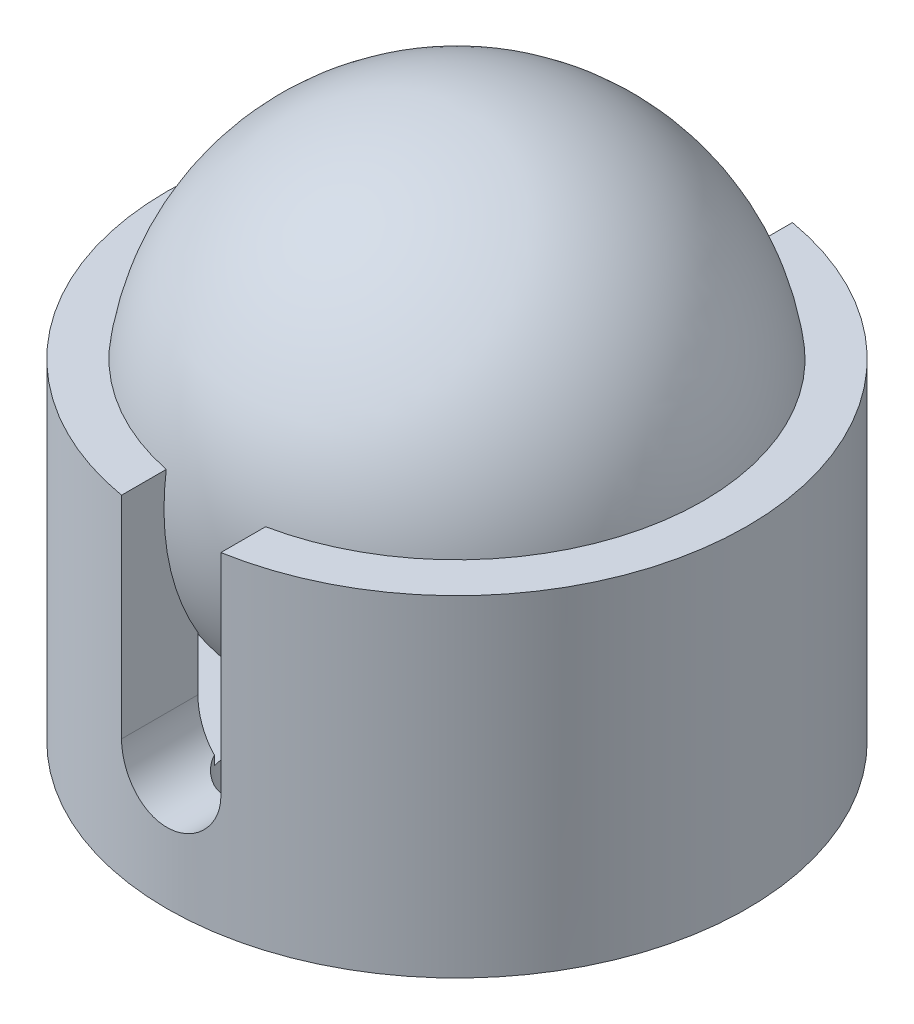
ISO-10303-21;
HEADER;
FILE_DESCRIPTION(('STEP AP214'),'2;1');
FILE_NAME('part.step','',(''),(''),'','','');
FILE_SCHEMA(('AUTOMOTIVE_DESIGN { 1 0 10303 214 1 1 1 1 }'));
ENDSEC;
DATA;
#1=APPLICATION_CONTEXT('core data for automotive mechanical design processes');
#2=APPLICATION_PROTOCOL_DEFINITION('international standard','automotive_design',2000,#1);
#3=PRODUCT_CONTEXT('',#1,'mechanical');
#4=PRODUCT('Part','Part','',(#3));
#5=PRODUCT_RELATED_PRODUCT_CATEGORY('part','',(#4));
#6=PRODUCT_DEFINITION_FORMATION('','',#4);
#7=PRODUCT_DEFINITION_CONTEXT('part definition',#1,'design');
#8=PRODUCT_DEFINITION('design','',#6,#7);
#9=PRODUCT_DEFINITION_SHAPE('','',#8);
#10=(LENGTH_UNIT() NAMED_UNIT(*) SI_UNIT(.MILLI.,.METRE.));
#11=(NAMED_UNIT(*) PLANE_ANGLE_UNIT() SI_UNIT($,.RADIAN.));
#12=(NAMED_UNIT(*) SI_UNIT($,.STERADIAN.) SOLID_ANGLE_UNIT());
#13=UNCERTAINTY_MEASURE_WITH_UNIT(LENGTH_MEASURE(1.E-05),#10,'distance_accuracy_value','');
#14=(GEOMETRIC_REPRESENTATION_CONTEXT(3) GLOBAL_UNCERTAINTY_ASSIGNED_CONTEXT((#13)) GLOBAL_UNIT_ASSIGNED_CONTEXT((#10,
#11,#12)) REPRESENTATION_CONTEXT('',''));
#15=CARTESIAN_POINT('',(0.,0.,0.));
#16=DIRECTION('',(0.,0.,1.));
#17=DIRECTION('',(1.,0.,0.));
#18=AXIS2_PLACEMENT_3D('',#15,#16,#17);
#19=CARTESIAN_POINT('',(0.,2.7,0.));
#20=DIRECTION('',(0.,1.,0.));
#21=DIRECTION('',(0.,0.,1.));
#22=AXIS2_PLACEMENT_3D('',#19,#20,#21);
#23=CYLINDRICAL_SURFACE('',#22,8.255);
#24=CARTESIAN_POINT('',(0.,2.7,0.));
#25=DIRECTION('',(0.,1.,0.));
#26=DIRECTION('',(0.,0.,1.));
#27=AXIS2_PLACEMENT_3D('',#24,#25,#26);
#28=CIRCLE('',#27,8.255);
#29=CARTESIAN_POINT('',(-1.12700211108679,2.7,-8.17770696721312));
#30=VERTEX_POINT('',#29);
#31=CARTESIAN_POINT('',(-1.12700211108679,2.7,8.17770696721311));
#32=VERTEX_POINT('',#31);
#33=EDGE_CURVE('E150',#30,#32,#28,.T.);
#34=ORIENTED_EDGE('',*,*,#33,.F.);
#35=DIRECTION('',(0.,1.,0.));
#36=VECTOR('',#35,1.);
#37=CARTESIAN_POINT('',(-1.12700211108679,4.68904755939854,-8.17770696721312));
#38=LINE('',#37,#36);
#39=CARTESIAN_POINT('',(-1.12700211108679,3.06913176294126,-8.17770696721312));
#40=VERTEX_POINT('',#39);
#41=EDGE_CURVE('E134',#40,#30,#38,.F.);
#42=ORIENTED_EDGE('',*,*,#41,.F.);
#43=CARTESIAN_POINT('',(1.905,4.605,-8.03218525682768));
#44=CARTESIAN_POINT('',(1.9050004949392,4.55216821729791,-8.03218203879732));
#45=CARTESIAN_POINT('',(1.90280080921067,4.49936247493051,-8.03270717235725));
#46=CARTESIAN_POINT('',(1.89403094658263,4.39414326350665,-8.03478076524727));
#47=CARTESIAN_POINT('',(1.88746142429757,4.34172973688419,-8.03632907130286));
#48=CARTESIAN_POINT('',(1.86128864629187,4.18584224632262,-8.04244801156491));
#49=CARTESIAN_POINT('',(1.83522080408885,4.08343529123638,-8.04849302089267));
#50=CARTESIAN_POINT('',(1.76667175449757,3.88460255311886,-8.06381500734212));
#51=CARTESIAN_POINT('',(1.72419070255448,3.78817671345208,-8.07309195385492));
#52=CARTESIAN_POINT('',(1.62406527798472,3.60377986365608,-8.09382741519176));
#53=CARTESIAN_POINT('',(1.56641785887882,3.5158105570497,-8.10528636818917));
#54=CARTESIAN_POINT('',(1.43645531360547,3.3492255076306,-8.12933261434897));
#55=CARTESIAN_POINT('',(1.36391060377247,3.27079118867273,-8.14193559653943));
#56=CARTESIAN_POINT('',(1.20670065058701,3.12708189753966,-8.16671418743262));
#57=CARTESIAN_POINT('',(1.12203350133048,3.06180899851187,-8.17888972855704));
#58=CARTESIAN_POINT('',(0.941751579429275,2.94555261185414,-8.20161368130246));
#59=CARTESIAN_POINT('',(0.846019761038323,2.8947462141507,-8.21214127169099));
#60=CARTESIAN_POINT('',(0.647097553577047,2.81001475173687,-8.23020347271179));
#61=CARTESIAN_POINT('',(0.543908485299424,2.77608670596432,-8.2377386118247));
#62=CARTESIAN_POINT('',(0.334897812779147,2.72664974398737,-8.24885603313697));
#63=CARTESIAN_POINT('',(0.229153018304933,2.71083126635109,-8.25250467254132));
#64=CARTESIAN_POINT('',(0.016449470314749,2.697093061312,-8.25566843713098));
#65=CARTESIAN_POINT('',(-0.0905091555585277,2.69917146903084,-8.25518399298893));
#66=CARTESIAN_POINT('',(-0.300460364163674,2.72094109315607,-8.25018624071996));
#67=CARTESIAN_POINT('',(-0.40348969555063,2.74029805669144,-8.2457493949175));
#68=CARTESIAN_POINT('',(-0.604795878082817,2.79554078705041,-8.23343323662216));
#69=CARTESIAN_POINT('',(-0.703072538393995,2.83142721697394,-8.22555378602559));
#70=CARTESIAN_POINT('',(-0.892996247776186,2.9189969205741,-8.20711687811029));
#71=CARTESIAN_POINT('',(-0.984583992533556,2.97080423091211,-8.19653850795575));
#72=CARTESIAN_POINT('',(-1.15788342478523,3.08865083741645,-8.17385957434472));
#73=CARTESIAN_POINT('',(-1.23959389020896,3.15469189185143,-8.16175882290817));
#74=CARTESIAN_POINT('',(-1.3928034399678,3.30093157665607,-8.13703217107836));
#75=CARTESIAN_POINT('',(-1.4640241759925,3.3814211038199,-8.12440059415062));
#76=CARTESIAN_POINT('',(-1.59203014189117,3.55335758711994,-8.10029145269488));
#77=CARTESIAN_POINT('',(-1.64881142789759,3.64480752687592,-8.08881420396651));
#78=CARTESIAN_POINT('',(-1.7464734319975,3.83656846314659,-8.06829385553909));
#79=CARTESIAN_POINT('',(-1.78728722256415,3.9369146393702,-8.05926104939383));
#80=CARTESIAN_POINT('',(-1.85133161484183,4.14323888784974,-8.04479287806192));
#81=CARTESIAN_POINT('',(-1.8745884213678,4.24920831303048,-8.03935215301505));
#82=CARTESIAN_POINT('',(-1.89413110521301,4.39755626711869,-8.03475650344726));
#83=CARTESIAN_POINT('',(-1.8982079605321,4.43896954145468,-8.03379358952638));
#84=CARTESIAN_POINT('',(-1.9036391869607,4.5219154526723,-8.03250835935586));
#85=CARTESIAN_POINT('',(-1.90499804312288,4.56344777947494,-8.03218498778796));
#86=CARTESIAN_POINT('',(-1.905,4.605,-8.03218525682768));
#87=B_SPLINE_CURVE_WITH_KNOTS('',3,(#43,#44,#45,#46,#47,#48,#49,#50,#51,#52,#53,#54,#55,#56,#57,
#58,#59,#60,#61,#62,#63,#64,#65,#66,#67,#68,#69,#70,#71,#72,#73,#74,#75,#76,#77,#78,#79,#80,#81,
#82,#83,#84,#85,#86),.UNSPECIFIED.,.F.,.F.,(4,2,2,2,2,2,2,2,2,2,2,2,2,2,2,2,2,2,2,2,2,4),(0.,
0.15839566344919,0.316767604100791,0.632664406073719,0.948558216344822,1.26451552894804,
1.5857669443639,1.90706892287692,2.23214980580353,2.55717325239468,2.87655372217706,
3.19590091250888,3.50920109847809,3.82251385396565,4.13833226029031,4.45418970147392,
4.77731778029453,5.10053402098423,5.42509086388387,5.74916232390456,5.8739620293273,
5.99855562852327),.UNSPECIFIED.);
#88=CARTESIAN_POINT('',(-1.905,4.605,-8.03218525682768));
#89=VERTEX_POINT('',#88);
#90=EDGE_CURVE('E180',#40,#89,#87,.T.);
#91=ORIENTED_EDGE('',*,*,#90,.T.);
#92=DIRECTION('',(0.,1.,0.));
#93=VECTOR('',#92,1.);
#94=CARTESIAN_POINT('',(-1.905,2.7,-8.03218525682768));
#95=LINE('',#94,#93);
#96=CARTESIAN_POINT('',(-1.90499999999999,6.67809511879709,-8.03218525682768));
#97=VERTEX_POINT('',#96);
#98=EDGE_CURVE('E42',#89,#97,#95,.T.);
#99=ORIENTED_EDGE('',*,*,#98,.T.);
#100=CARTESIAN_POINT('',(0.,6.67809511879709,0.));
#101=DIRECTION('',(0.,1.,0.));
#102=DIRECTION('',(0.,0.,1.));
#103=AXIS2_PLACEMENT_3D('',#100,#101,#102);
#104=CIRCLE('',#103,8.255);
#105=CARTESIAN_POINT('',(-1.90499999999999,6.67809511879709,8.03218525682768));
#106=VERTEX_POINT('',#105);
#107=EDGE_CURVE('E178',#106,#97,#104,.F.);
#108=ORIENTED_EDGE('',*,*,#107,.F.);
#109=DIRECTION('',(0.,1.,0.));
#110=VECTOR('',#109,1.);
#111=CARTESIAN_POINT('',(-1.905,2.7,8.03218525682768));
#112=LINE('',#111,#110);
#113=CARTESIAN_POINT('',(-1.905,4.605,8.03218525682768));
#114=VERTEX_POINT('',#113);
#115=EDGE_CURVE('E172',#106,#114,#112,.F.);
#116=ORIENTED_EDGE('',*,*,#115,.T.);
#117=CARTESIAN_POINT('',(-1.905,4.605,8.03218525682768));
#118=CARTESIAN_POINT('',(-1.90500049469628,4.55216655621658,8.03218203799778));
#119=CARTESIAN_POINT('',(-1.90280067052275,4.4993591523997,8.03270720505691));
#120=CARTESIAN_POINT('',(-1.89403025787273,4.39413666029557,8.03478092806602));
#121=CARTESIAN_POINT('',(-1.88746032453257,4.3417215143946,8.03632933061945));
#122=CARTESIAN_POINT('',(-1.86128700475584,4.18583579528771,8.04244839059668));
#123=CARTESIAN_POINT('',(-1.83521971292944,4.08343216071447,8.04849326201394));
#124=CARTESIAN_POINT('',(-1.76667225992256,3.88460398466465,8.0638148971434));
#125=CARTESIAN_POINT('',(-1.72419197369137,3.78817948874966,8.07309168547954));
#126=CARTESIAN_POINT('',(-1.62406687928407,3.60378237852894,8.09382708865287));
#127=CARTESIAN_POINT('',(-1.56641859128507,3.51581171001995,8.10528620398981));
#128=CARTESIAN_POINT('',(-1.43645653461048,3.34922685494659,8.12933241759931));
#129=CARTESIAN_POINT('',(-1.3639136082857,3.27079376627158,8.14193517616468));
#130=CARTESIAN_POINT('',(-1.20670260155131,3.1270838499302,8.16671382695744));
#131=CARTESIAN_POINT('',(-1.12203223435199,3.06180950912128,8.17888963813802));
#132=CARTESIAN_POINT('',(-0.941728524639734,2.94553640116307,8.20161684041124));
#133=CARTESIAN_POINT('',(-0.845975526116637,2.89471886009093,8.21214692226774));
#134=CARTESIAN_POINT('',(-0.647028333621074,2.8099937763538,8.23020812680588));
#135=CARTESIAN_POINT('',(-0.543839734290579,2.77607366881504,8.23774147700461));
#136=CARTESIAN_POINT('',(-0.366739452906919,2.73417900053674,8.24716289361645));
#137=CARTESIAN_POINT('',(-0.29398761185404,2.7213797190435,8.25008517222124));
#138=CARTESIAN_POINT('',(-0.147502877248877,2.70428597616014,8.25401086637504));
#139=CARTESIAN_POINT('',(-0.0737708465669586,2.69998447630629,8.25501586992314));
#140=CARTESIAN_POINT('',(0.,2.7,8.255));
#141=B_SPLINE_CURVE_WITH_KNOTS('',3,(#117,#118,#119,#120,#121,#122,#123,#124,#125,#126,#127,
#128,#129,#130,#131,#132,#133,#134,#135,#136,#137,#138,#139,#140),.UNSPECIFIED.,.F.,.F.,(4,2,2,
2,2,2,2,2,2,2,2,4),(0.,0.158400642975513,0.316777544979892,0.632664432652759,0.948553727117127,
1.2645155557716,1.58576192509944,1.90706894963035,2.23224219722809,2.55717328482657,
2.77846377764801,2.99957090505832),.UNSPECIFIED.);
#142=CARTESIAN_POINT('',(-1.12700211108679,3.06913176294126,8.17770696721312));
#143=VERTEX_POINT('',#142);
#144=EDGE_CURVE('E222',#114,#143,#141,.T.);
#145=ORIENTED_EDGE('',*,*,#144,.T.);
#146=DIRECTION('',(0.,1.,0.));
#147=VECTOR('',#146,1.);
#148=CARTESIAN_POINT('',(-1.12700211108679,4.68904755939854,8.17770696721312));
#149=LINE('',#148,#147);
#150=EDGE_CURVE('E57',#32,#143,#149,.T.);
#151=ORIENTED_EDGE('',*,*,#150,.F.);
#152=EDGE_LOOP('',(#34,#42,#91,#99,#108,#116,#145,#151));
#153=FACE_BOUND('',#152,.T.);
#154=ADVANCED_FACE('F33',(#153),#23,.F.);
#155=CARTESIAN_POINT('',(1.905,4.605,-8.03218525682768));
#156=VERTEX_POINT('',#155);
#157=CARTESIAN_POINT('',(1.12700211108679,3.06913176294126,-8.17770696721312));
#158=VERTEX_POINT('',#157);
#159=EDGE_CURVE('E223',#156,#158,#87,.T.);
#160=ORIENTED_EDGE('',*,*,#159,.T.);
#161=DIRECTION('',(0.,1.,0.));
#162=VECTOR('',#161,1.);
#163=CARTESIAN_POINT('',(1.12700211108679,4.68904755939854,-8.17770696721312));
#164=LINE('',#163,#162);
#165=CARTESIAN_POINT('',(1.12700211108679,2.7,-8.17770696721312));
#166=VERTEX_POINT('',#165);
#167=EDGE_CURVE('E49',#166,#158,#164,.T.);
#168=ORIENTED_EDGE('',*,*,#167,.F.);
#169=CARTESIAN_POINT('',(1.12700211108679,2.7,8.17770696721312));
#170=VERTEX_POINT('',#169);
#171=EDGE_CURVE('E152',#170,#166,#28,.T.);
#172=ORIENTED_EDGE('',*,*,#171,.F.);
#173=DIRECTION('',(0.,1.,0.));
#174=VECTOR('',#173,1.);
#175=CARTESIAN_POINT('',(1.12700211108679,4.68904755939854,8.17770696721312));
#176=LINE('',#175,#174);
#177=CARTESIAN_POINT('',(1.12700211108679,3.06913176294126,8.17770696721312));
#178=VERTEX_POINT('',#177);
#179=EDGE_CURVE('E337',#178,#170,#176,.F.);
#180=ORIENTED_EDGE('',*,*,#179,.F.);
#181=CARTESIAN_POINT('',(0.,2.7,8.255));
#182=CARTESIAN_POINT('',(0.0528524320983628,2.69999955634984,8.25500279679877));
#183=CARTESIAN_POINT('',(0.105678887190966,2.70220091415277,8.25449179560521));
#184=CARTESIAN_POINT('',(0.210940560278556,2.71097776730944,8.25247195086839));
#185=CARTESIAN_POINT('',(0.263375832248552,2.7175526474838,8.250963247662));
#186=CARTESIAN_POINT('',(0.419329070667064,2.74374739522261,8.24499567147394));
#187=CARTESIAN_POINT('',(0.521781500884798,2.76983774284979,8.23909501464457));
#188=CARTESIAN_POINT('',(0.720710037257143,2.83845227723184,8.22408556447602));
#189=CARTESIAN_POINT('',(0.817185851405876,2.88097726621785,8.21497661453099));
#190=CARTESIAN_POINT('',(1.00166792716265,2.98120688884484,8.19452889266194));
#191=CARTESIAN_POINT('',(1.08967246792811,3.03891459783139,8.18318966910102));
#192=CARTESIAN_POINT('',(1.2562199743169,3.16893759430862,8.15929761959949));
#193=CARTESIAN_POINT('',(1.33459208892628,3.24146863664758,8.14672849221702));
#194=CARTESIAN_POINT('',(1.4781841373474,3.39863060636819,8.121903592809));
#195=CARTESIAN_POINT('',(1.5434012831974,3.48326409216631,8.1096478876873));
#196=CARTESIAN_POINT('',(1.65961234129271,3.66353315490595,8.08667282420945));
#197=CARTESIAN_POINT('',(1.71041509623268,3.75929480974598,8.07597495457146));
#198=CARTESIAN_POINT('',(1.79510979309718,3.95825911841009,8.05757379426781));
#199=CARTESIAN_POINT('',(1.82901473542413,4.06145598174149,8.04986820249189));
#200=CARTESIAN_POINT('',(1.87086855986302,4.238514926756,8.04022275210696));
#201=CARTESIAN_POINT('',(1.88364954400623,4.31121369457622,8.03722729796108));
#202=CARTESIAN_POINT('',(1.90071973905755,4.45759574316516,8.03320048782097));
#203=CARTESIAN_POINT('',(1.90501562488087,4.53127820412003,8.03216758798171));
#204=CARTESIAN_POINT('',(1.905,4.605,8.03218525682768));
#205=B_SPLINE_CURVE_WITH_KNOTS('',3,(#181,#182,#183,#184,#185,#186,#187,#188,#189,#190,#191,
#192,#193,#194,#195,#196,#197,#198,#199,#200,#201,#202,#203,#204),.UNSPECIFIED.,.F.,.F.,(4,2,2,
2,2,2,2,2,2,2,2,4),(0.,0.158457782563259,0.316893281176784,0.632914335343853,0.948950817529517,
1.26505136403747,1.58613050911557,1.90727762987949,2.23250338713205,2.55747854284732,
2.77861157657607,2.99957058367589),.UNSPECIFIED.);
#206=CARTESIAN_POINT('',(1.905,4.605,8.03218525682768));
#207=VERTEX_POINT('',#206);
#208=EDGE_CURVE('E247',#178,#207,#205,.T.);
#209=ORIENTED_EDGE('',*,*,#208,.T.);
#210=DIRECTION('',(0.,1.,0.));
#211=VECTOR('',#210,1.);
#212=CARTESIAN_POINT('',(1.905,2.7,8.03218525682768));
#213=LINE('',#212,#211);
#214=CARTESIAN_POINT('',(1.905,6.67809511879708,8.03218525682768));
#215=VERTEX_POINT('',#214);
#216=EDGE_CURVE('E169',#207,#215,#213,.T.);
#217=ORIENTED_EDGE('',*,*,#216,.T.);
#218=CARTESIAN_POINT('',(0.,6.67809511879709,0.));
#219=DIRECTION('',(0.,1.,0.));
#220=DIRECTION('',(0.,0.,1.));
#221=AXIS2_PLACEMENT_3D('',#218,#219,#220);
#222=CIRCLE('',#221,8.255);
#223=CARTESIAN_POINT('',(1.905,6.67809511879708,-8.03218525682768));
#224=VERTEX_POINT('',#223);
#225=EDGE_CURVE('E323',#224,#215,#222,.F.);
#226=ORIENTED_EDGE('',*,*,#225,.F.);
#227=DIRECTION('',(0.,1.,0.));
#228=VECTOR('',#227,1.);
#229=CARTESIAN_POINT('',(1.905,2.7,-8.03218525682768));
#230=LINE('',#229,#228);
#231=EDGE_CURVE('E174',#224,#156,#230,.F.);
#232=ORIENTED_EDGE('',*,*,#231,.T.);
#233=EDGE_LOOP('',(#160,#168,#172,#180,#209,#217,#226,#232));
#234=FACE_BOUND('',#233,.T.);
#235=ADVANCED_FACE('F298',(#234),#23,.F.);
#236=CARTESIAN_POINT('',(0.,12.7,0.));
#237=DIRECTION('',(0.,1.,0.));
#238=DIRECTION('',(0.,0.,1.));
#239=AXIS2_PLACEMENT_3D('',#236,#237,#238);
#240=PLANE('',#239);
#241=DIRECTION('',(0.,0.,-1.));
#242=VECTOR('',#241,1.);
#243=CARTESIAN_POINT('',(-1.90499999999999,12.7,11.1252));
#244=LINE('',#243,#242);
#245=CARTESIAN_POINT('',(-1.90499999999999,12.7,10.9608872834274));
#246=VERTEX_POINT('',#245);
#247=CARTESIAN_POINT('',(-1.90499999999999,12.7,9.24573955938626));
#248=VERTEX_POINT('',#247);
#249=EDGE_CURVE('E206',#246,#248,#244,.T.);
#250=ORIENTED_EDGE('',*,*,#249,.T.);
#251=CARTESIAN_POINT('',(0.,12.7,0.));
#252=DIRECTION('',(0.,1.,0.));
#253=DIRECTION('',(0.,0.,1.));
#254=AXIS2_PLACEMENT_3D('',#251,#252,#253);
#255=CIRCLE('',#254,9.43995365454725);
#256=CARTESIAN_POINT('',(-1.90499999999999,12.7,-9.24573955938626));
#257=VERTEX_POINT('',#256);
#258=EDGE_CURVE('E191',#248,#257,#255,.F.);
#259=ORIENTED_EDGE('',*,*,#258,.T.);
#260=CARTESIAN_POINT('',(-1.90499999999999,12.7,-10.9608872834274));
#261=VERTEX_POINT('',#260);
#262=EDGE_CURVE('E204',#257,#261,#244,.T.);
#263=ORIENTED_EDGE('',*,*,#262,.T.);
#264=CARTESIAN_POINT('',(0.,12.7,0.));
#265=DIRECTION('',(0.,1.,0.));
#266=DIRECTION('',(0.,0.,1.));
#267=AXIS2_PLACEMENT_3D('',#264,#265,#266);
#268=CIRCLE('',#267,11.1252);
#269=EDGE_CURVE('E163',#261,#246,#268,.T.);
#270=ORIENTED_EDGE('',*,*,#269,.T.);
#271=EDGE_LOOP('',(#250,#259,#263,#270));
#272=FACE_BOUND('',#271,.T.);
#273=ADVANCED_FACE('F276',(#272),#240,.T.);
#274=CARTESIAN_POINT('',(0.,12.7,0.));
#275=DIRECTION('',(0.,-1.,0.));
#276=DIRECTION('',(0.,0.,-1.));
#277=AXIS2_PLACEMENT_3D('',#274,#275,#276);
#278=CYLINDRICAL_SURFACE('',#277,11.1252);
#279=ORIENTED_EDGE('',*,*,#269,.F.);
#280=DIRECTION('',(0.,-1.,0.));
#281=VECTOR('',#280,1.);
#282=CARTESIAN_POINT('',(-1.90499999999999,12.7,-10.9608872834274));
#283=LINE('',#282,#281);
#284=CARTESIAN_POINT('',(-1.905,4.605,-10.9608872834274));
#285=VERTEX_POINT('',#284);
#286=EDGE_CURVE('E155',#261,#285,#283,.T.);
#287=ORIENTED_EDGE('',*,*,#286,.T.);
#288=CARTESIAN_POINT('',(-1.905,4.605,-10.9608872834274));
#289=CARTESIAN_POINT('',(-1.90500011233125,4.55182357717917,-10.960884995668));
#290=CARTESIAN_POINT('',(-1.90277203176163,4.49867302124765,-10.961274752123));
#291=CARTESIAN_POINT('',(-1.89388638174144,4.39276004595248,-10.9628143978801));
#292=CARTESIAN_POINT('',(-1.88722926875973,4.33999758715694,-10.9639642088488));
#293=CARTESIAN_POINT('',(-1.86069286108463,4.18301012475276,-10.9685112671756));
#294=CARTESIAN_POINT('',(-1.83424822208422,4.07984903791765,-10.9730063466385));
#295=CARTESIAN_POINT('',(-1.76464200946933,3.8795154800923,-10.984413566789));
#296=CARTESIAN_POINT('',(-1.72147699343943,3.78234424708019,-10.9913262051787));
#297=CARTESIAN_POINT('',(-1.61968251882165,3.5966032923464,-11.0067862882413));
#298=CARTESIAN_POINT('',(-1.56105268130084,3.5080337814646,-11.0153337729712));
#299=CARTESIAN_POINT('',(-1.4293538459577,3.3411253113795,-11.0331983571576));
#300=CARTESIAN_POINT('',(-1.35615701015124,3.26288793439083,-11.0425218117836));
#301=CARTESIAN_POINT('',(-1.19766952332003,3.11973341444183,-11.0608324629256));
#302=CARTESIAN_POINT('',(-1.11237701967581,3.05481831570754,-11.0698196076641));
#303=CARTESIAN_POINT('',(-0.931458504337656,2.93977552224258,-11.0865121436267));
#304=CARTESIAN_POINT('',(-0.835770827943242,2.8897434784483,-11.0942091108084));
#305=CARTESIAN_POINT('',(-0.637200726078677,2.8065042819013,-11.1073821602652));
#306=CARTESIAN_POINT('',(-0.534319202541779,2.77329502426986,-11.112858520367));
#307=CARTESIAN_POINT('',(-0.325337631191098,2.7249545496934,-11.1209286384723));
#308=CARTESIAN_POINT('',(-0.219278566973777,2.70965082037397,-11.1235498870421));
#309=CARTESIAN_POINT('',(-0.00606534768267138,2.69701904403838,-11.1257089833242));
#310=CARTESIAN_POINT('',(0.101088754667481,2.69969013560847,-11.1252469787965));
#311=CARTESIAN_POINT('',(0.312264575029384,2.72279877688665,-11.1213132113094));
#312=CARTESIAN_POINT('',(0.416307334959863,2.74305017557476,-11.1178729846348));
#313=CARTESIAN_POINT('',(0.619495117636029,2.8004510477643,-11.1084045588651));
#314=CARTESIAN_POINT('',(0.718640016537816,2.83760094830726,-11.102376294368));
#315=CARTESIAN_POINT('',(0.909770805274797,2.92792834300016,-11.08835552466));
#316=CARTESIAN_POINT('',(1.00171982732219,2.98118233903621,-11.0803536782397));
#317=CARTESIAN_POINT('',(1.17544316393315,3.1021482973031,-11.0632743324721));
#318=CARTESIAN_POINT('',(1.25721698195965,3.1698609646612,-11.0541967806739));
#319=CARTESIAN_POINT('',(1.40936306143603,3.3188428969499,-11.0358383541986));
#320=CARTESIAN_POINT('',(1.47957756417946,3.40027320695339,-11.0265563609762));
#321=CARTESIAN_POINT('',(1.60539262454676,3.57386925428052,-11.0089436129948));
#322=CARTESIAN_POINT('',(1.66098903386476,3.66603802826796,-11.0006131286324));
#323=CARTESIAN_POINT('',(1.75602417533841,3.85869617911547,-10.9858445426247));
#324=CARTESIAN_POINT('',(1.79543366554793,3.95920022368685,-10.979409871673));
#325=CARTESIAN_POINT('',(1.85671034783892,4.16546839994332,-10.9692152381985));
#326=CARTESIAN_POINT('',(1.87860374989704,4.27122442008731,-10.9654512803466));
#327=CARTESIAN_POINT('',(1.89594956612767,4.4156583864186,-10.9624568844281));
#328=CARTESIAN_POINT('',(1.89934486680466,4.45347809699095,-10.9618688245833));
#329=CARTESIAN_POINT('',(1.90386714264824,4.52919300248417,-10.9610844115182));
#330=CARTESIAN_POINT('',(1.9049979320217,4.5670879626807,-10.9608873996452));
#331=CARTESIAN_POINT('',(1.905,4.605,-10.9608872834274));
#332=B_SPLINE_CURVE_WITH_KNOTS('',3,(#288,#289,#290,#291,#292,#293,#294,#295,#296,#297,#298,
#299,#300,#301,#302,#303,#304,#305,#306,#307,#308,#309,#310,#311,#312,#313,#314,#315,#316,#317,
#318,#319,#320,#321,#322,#323,#324,#325,#326,#327,#328,#329,#330,#331),.UNSPECIFIED.,.F.,.F.,(4,
2,2,2,2,2,2,2,2,2,2,2,2,2,2,2,2,2,2,2,2,4),(0.,0.159430028173395,0.318843627573064,
0.636971951702774,0.955165807393638,1.27336746048031,1.59449561942061,1.91567301682538,
2.23887205791271,2.56203065011643,2.88204941292081,3.20205283946116,3.5187086419787,
3.83537244714022,4.15356483460395,4.47177274336867,4.79401645356131,5.11635151125051,
5.43926633842499,5.761697067627,5.87557369429373,5.98925835213858),.UNSPECIFIED.);
#333=CARTESIAN_POINT('',(1.905,4.605,-10.9608872834274));
#334=VERTEX_POINT('',#333);
#335=EDGE_CURVE('E256',#285,#334,#332,.T.);
#336=ORIENTED_EDGE('',*,*,#335,.T.);
#337=DIRECTION('',(0.,-1.,0.));
#338=VECTOR('',#337,1.);
#339=CARTESIAN_POINT('',(1.905,12.7,-10.9608872834274));
#340=LINE('',#339,#338);
#341=CARTESIAN_POINT('',(1.905,12.7,-10.9608872834274));
#342=VERTEX_POINT('',#341);
#343=EDGE_CURVE('E261',#334,#342,#340,.F.);
#344=ORIENTED_EDGE('',*,*,#343,.T.);
#345=CARTESIAN_POINT('',(1.905,12.7,10.9608872834274));
#346=VERTEX_POINT('',#345);
#347=EDGE_CURVE('E166',#346,#342,#268,.T.);
#348=ORIENTED_EDGE('',*,*,#347,.F.);
#349=DIRECTION('',(0.,-1.,0.));
#350=VECTOR('',#349,1.);
#351=CARTESIAN_POINT('',(1.905,12.7,10.9608872834274));
#352=LINE('',#351,#350);
#353=CARTESIAN_POINT('',(1.905,4.605,10.9608872834274));
#354=VERTEX_POINT('',#353);
#355=EDGE_CURVE('E264',#346,#354,#352,.T.);
#356=ORIENTED_EDGE('',*,*,#355,.T.);
#357=CARTESIAN_POINT('',(1.905,4.605,10.9608872834274));
#358=CARTESIAN_POINT('',(1.90500011233124,4.55182357717917,10.960884995668));
#359=CARTESIAN_POINT('',(1.90277203176163,4.49867302124765,10.961274752123));
#360=CARTESIAN_POINT('',(1.89388638174144,4.39276004595248,10.9628143978801));
#361=CARTESIAN_POINT('',(1.88722926875973,4.33999758715694,10.9639642088488));
#362=CARTESIAN_POINT('',(1.86069286108462,4.18301012475276,10.9685112671756));
#363=CARTESIAN_POINT('',(1.83424822208421,4.07984903791765,10.9730063466385));
#364=CARTESIAN_POINT('',(1.76464200946932,3.8795154800923,10.984413566789));
#365=CARTESIAN_POINT('',(1.72147699343942,3.78234424708018,10.9913262051787));
#366=CARTESIAN_POINT('',(1.61968251882165,3.59660329234639,11.0067862882413));
#367=CARTESIAN_POINT('',(1.56105268130083,3.5080337814646,11.0153337729712));
#368=CARTESIAN_POINT('',(1.42935384595769,3.3411253113795,11.0331983571576));
#369=CARTESIAN_POINT('',(1.35615701015124,3.26288793439083,11.0425218117836));
#370=CARTESIAN_POINT('',(1.19766952332002,3.11973341444183,11.0608324629256));
#371=CARTESIAN_POINT('',(1.1123770196758,3.05481831570754,11.0698196076641));
#372=CARTESIAN_POINT('',(0.931458504337649,2.93977552224258,11.0865121436267));
#373=CARTESIAN_POINT('',(0.835770827943234,2.8897434784483,11.0942091108084));
#374=CARTESIAN_POINT('',(0.637200726078669,2.8065042819013,11.1073821602652));
#375=CARTESIAN_POINT('',(0.534319202541771,2.77329502426986,11.112858520367));
#376=CARTESIAN_POINT('',(0.32533763119109,2.7249545496934,11.1209286384723));
#377=CARTESIAN_POINT('',(0.21927856697377,2.70965082037397,11.1235498870421));
#378=CARTESIAN_POINT('',(0.00606534768266428,2.69701904403838,11.1257089833242));
#379=CARTESIAN_POINT('',(-0.101088754667488,2.69969013560847,11.1252469787965));
#380=CARTESIAN_POINT('',(-0.312264575029391,2.72279877688665,11.1213132113094));
#381=CARTESIAN_POINT('',(-0.41630733495987,2.74305017557476,11.1178729846348));
#382=CARTESIAN_POINT('',(-0.619495117636036,2.8004510477643,11.1084045588651));
#383=CARTESIAN_POINT('',(-0.718640016537823,2.83760094830726,11.102376294368));
#384=CARTESIAN_POINT('',(-0.909770805274803,2.92792834300016,11.08835552466));
#385=CARTESIAN_POINT('',(-1.0017198273222,2.98118233903621,11.0803536782397));
#386=CARTESIAN_POINT('',(-1.17544316393315,3.1021482973031,11.0632743324721));
#387=CARTESIAN_POINT('',(-1.25721698195965,3.1698609646612,11.0541967806739));
#388=CARTESIAN_POINT('',(-1.40936306143604,3.3188428969499,11.0358383541986));
#389=CARTESIAN_POINT('',(-1.47957756417946,3.40027320695339,11.0265563609762));
#390=CARTESIAN_POINT('',(-1.60539262454676,3.57386925428053,11.0089436129948));
#391=CARTESIAN_POINT('',(-1.66098903386476,3.66603802826796,11.0006131286324));
#392=CARTESIAN_POINT('',(-1.75602417533841,3.85869617911547,10.9858445426247));
#393=CARTESIAN_POINT('',(-1.79543366554793,3.95920022368686,10.979409871673));
#394=CARTESIAN_POINT('',(-1.85671034783893,4.16546839994332,10.9692152381985));
#395=CARTESIAN_POINT('',(-1.87860374989705,4.27122442008731,10.9654512803466));
#396=CARTESIAN_POINT('',(-1.89594956612768,4.41565838641861,10.9624568844281));
#397=CARTESIAN_POINT('',(-1.89934486680466,4.45347809699095,10.9618688245833));
#398=CARTESIAN_POINT('',(-1.90386714264825,4.52919300248417,10.9610844115182));
#399=CARTESIAN_POINT('',(-1.9049979320217,4.5670879626807,10.9608873996452));
#400=CARTESIAN_POINT('',(-1.905,4.60500000000001,10.9608872834274));
#401=B_SPLINE_CURVE_WITH_KNOTS('',3,(#357,#358,#359,#360,#361,#362,#363,#364,#365,#366,#367,
#368,#369,#370,#371,#372,#373,#374,#375,#376,#377,#378,#379,#380,#381,#382,#383,#384,#385,#386,
#387,#388,#389,#390,#391,#392,#393,#394,#395,#396,#397,#398,#399,#400),.UNSPECIFIED.,.F.,.F.,(4,
2,2,2,2,2,2,2,2,2,2,2,2,2,2,2,2,2,2,2,2,4),(0.,0.159430028173395,0.318843627573065,
0.636971951702775,0.955165807393639,1.27336746048031,1.59449561942062,1.91567301682538,
2.23887205791271,2.56203065011643,2.88204941292081,3.20205283946116,3.5187086419787,
3.83537244714022,4.15356483460394,4.47177274336867,4.79401645356131,5.11635151125051,
5.43926633842498,5.761697067627,5.87557369429372,5.98925835213858),.UNSPECIFIED.);
#402=CARTESIAN_POINT('',(-1.905,4.605,10.9608872834274));
#403=VERTEX_POINT('',#402);
#404=EDGE_CURVE('E252',#354,#403,#401,.T.);
#405=ORIENTED_EDGE('',*,*,#404,.T.);
#406=DIRECTION('',(0.,-1.,0.));
#407=VECTOR('',#406,1.);
#408=CARTESIAN_POINT('',(-1.90499999999999,12.7,10.9608872834274));
#409=LINE('',#408,#407);
#410=EDGE_CURVE('E159',#403,#246,#409,.F.);
#411=ORIENTED_EDGE('',*,*,#410,.T.);
#412=EDGE_LOOP('',(#279,#287,#336,#344,#348,#356,#405,#411));
#413=FACE_BOUND('',#412,.T.);
#414=CARTESIAN_POINT('',(0.,0.,0.));
#415=DIRECTION('',(0.,1.,0.));
#416=DIRECTION('',(0.,0.,1.));
#417=AXIS2_PLACEMENT_3D('',#414,#415,#416);
#418=CIRCLE('',#417,11.1252);
#419=CARTESIAN_POINT('',(0.,0.,11.1252));
#420=VERTEX_POINT('',#419);
#421=EDGE_CURVE('E157',#420,#420,#418,.T.);
#422=ORIENTED_EDGE('',*,*,#421,.T.);
#423=EDGE_LOOP('',(#422));
#424=FACE_BOUND('',#423,.T.);
#425=ADVANCED_FACE('F35',(#413,#424),#278,.T.);
#426=DIRECTION('',(0.,0.,-1.));
#427=VECTOR('',#426,1.);
#428=CARTESIAN_POINT('',(1.905,12.7,11.1252));
#429=LINE('',#428,#427);
#430=CARTESIAN_POINT('',(1.905,12.7,-9.24573955938626));
#431=VERTEX_POINT('',#430);
#432=EDGE_CURVE('E203',#431,#342,#429,.T.);
#433=ORIENTED_EDGE('',*,*,#432,.F.);
#434=CARTESIAN_POINT('',(0.,12.7,0.));
#435=DIRECTION('',(0.,1.,0.));
#436=DIRECTION('',(0.,0.,1.));
#437=AXIS2_PLACEMENT_3D('',#434,#435,#436);
#438=CIRCLE('',#437,9.43995365454725);
#439=CARTESIAN_POINT('',(1.905,12.7,9.24573955938626));
#440=VERTEX_POINT('',#439);
#441=EDGE_CURVE('E318',#431,#440,#438,.F.);
#442=ORIENTED_EDGE('',*,*,#441,.T.);
#443=EDGE_CURVE('E214',#346,#440,#429,.T.);
#444=ORIENTED_EDGE('',*,*,#443,.F.);
#445=ORIENTED_EDGE('',*,*,#347,.T.);
#446=EDGE_LOOP('',(#433,#442,#444,#445));
#447=FACE_BOUND('',#446,.T.);
#448=ADVANCED_FACE('F305',(#447),#240,.T.);
#449=CARTESIAN_POINT('',(0.,0.,0.));
#450=DIRECTION('',(0.,1.,0.));
#451=DIRECTION('',(0.,0.,1.));
#452=AXIS2_PLACEMENT_3D('',#449,#450,#451);
#453=PLANE('',#452);
#454=CARTESIAN_POINT('',(0.,0.,-7.747));
#455=DIRECTION('',(0.,-1.,0.));
#456=DIRECTION('',(0.,0.,-1.));
#457=AXIS2_PLACEMENT_3D('',#454,#455,#456);
#458=CIRCLE('',#457,1.2065);
#459=CARTESIAN_POINT('',(0.,0.,-8.9535));
#460=VERTEX_POINT('',#459);
#461=EDGE_CURVE('E143',#460,#460,#458,.T.);
#462=ORIENTED_EDGE('',*,*,#461,.F.);
#463=EDGE_LOOP('',(#462));
#464=FACE_BOUND('',#463,.T.);
#465=CARTESIAN_POINT('',(0.,0.,7.747));
#466=DIRECTION('',(0.,-1.,0.));
#467=DIRECTION('',(0.,0.,-1.));
#468=AXIS2_PLACEMENT_3D('',#465,#466,#467);
#469=CIRCLE('',#468,1.2065);
#470=CARTESIAN_POINT('',(0.,0.,6.5405));
#471=VERTEX_POINT('',#470);
#472=EDGE_CURVE('E327',#471,#471,#469,.T.);
#473=ORIENTED_EDGE('',*,*,#472,.F.);
#474=EDGE_LOOP('',(#473));
#475=FACE_BOUND('',#474,.T.);
#476=ORIENTED_EDGE('',*,*,#421,.F.);
#477=EDGE_LOOP('',(#476));
#478=FACE_BOUND('',#477,.T.);
#479=ADVANCED_FACE('F310',(#464,#475,#478),#453,.F.);
#480=CARTESIAN_POINT('',(0.,2.7,0.));
#481=DIRECTION('',(0.,1.,0.));
#482=DIRECTION('',(0.,0.,1.));
#483=AXIS2_PLACEMENT_3D('',#480,#481,#482);
#484=PLANE('',#483);
#485=CARTESIAN_POINT('',(0.,2.7,-7.747));
#486=DIRECTION('',(0.,1.,0.));
#487=DIRECTION('',(0.,0.,1.));
#488=AXIS2_PLACEMENT_3D('',#485,#486,#487);
#489=CIRCLE('',#488,1.2065);
#490=EDGE_CURVE('E138',#166,#30,#489,.F.);
#491=ORIENTED_EDGE('',*,*,#490,.T.);
#492=ORIENTED_EDGE('',*,*,#33,.T.);
#493=CARTESIAN_POINT('',(0.,2.7,7.747));
#494=DIRECTION('',(0.,1.,0.));
#495=DIRECTION('',(0.,0.,1.));
#496=AXIS2_PLACEMENT_3D('',#493,#494,#495);
#497=CIRCLE('',#496,1.2065);
#498=EDGE_CURVE('E330',#32,#170,#497,.F.);
#499=ORIENTED_EDGE('',*,*,#498,.T.);
#500=ORIENTED_EDGE('',*,*,#171,.T.);
#501=EDGE_LOOP('',(#491,#492,#499,#500));
#502=FACE_BOUND('',#501,.T.);
#503=CARTESIAN_POINT('',(0.,2.7,0.));
#504=DIRECTION('',(0.,1.,0.));
#505=DIRECTION('',(0.,0.,1.));
#506=AXIS2_PLACEMENT_3D('',#503,#504,#505);
#507=CIRCLE('',#506,3.80955706086679);
#508=CARTESIAN_POINT('',(0.,2.7,3.80955706086679));
#509=VERTEX_POINT('',#508);
#510=EDGE_CURVE('E200',#509,#509,#507,.F.);
#511=ORIENTED_EDGE('',*,*,#510,.T.);
#512=EDGE_LOOP('',(#511));
#513=FACE_BOUND('',#512,.T.);
#514=ADVANCED_FACE('F147',(#502,#513),#484,.T.);
#515=CARTESIAN_POINT('',(1.905,12.7,11.1252));
#516=DIRECTION('',(1.,0.,0.));
#517=DIRECTION('',(0.,1.,0.));
#518=AXIS2_PLACEMENT_3D('',#515,#516,#517);
#519=PLANE('',#518);
#520=CARTESIAN_POINT('',(1.905,11.43,0.));
#521=DIRECTION('',(1.,0.,0.));
#522=DIRECTION('',(0.,1.,0.));
#523=AXIS2_PLACEMENT_3D('',#520,#521,#522);
#524=CIRCLE('',#523,9.33255592000391);
#525=EDGE_CURVE('E195',#215,#440,#524,.F.);
#526=ORIENTED_EDGE('',*,*,#525,.F.);
#527=ORIENTED_EDGE('',*,*,#216,.F.);
#528=DIRECTION('',(0.,0.,-1.));
#529=VECTOR('',#528,1.);
#530=CARTESIAN_POINT('',(1.905,4.605,11.1252));
#531=LINE('',#530,#529);
#532=EDGE_CURVE('E210',#354,#207,#531,.T.);
#533=ORIENTED_EDGE('',*,*,#532,.F.);
#534=ORIENTED_EDGE('',*,*,#355,.F.);
#535=ORIENTED_EDGE('',*,*,#443,.T.);
#536=EDGE_LOOP('',(#526,#527,#533,#534,#535));
#537=FACE_BOUND('',#536,.T.);
#538=ADVANCED_FACE('F241',(#537),#519,.F.);
#539=CARTESIAN_POINT('',(0.,4.605,11.1252));
#540=DIRECTION('',(0.,0.,-1.));
#541=DIRECTION('',(-1.,0.,0.));
#542=AXIS2_PLACEMENT_3D('',#539,#540,#541);
#543=CYLINDRICAL_SURFACE('',#542,1.905);
#544=ORIENTED_EDGE('',*,*,#208,.F.);
#545=CARTESIAN_POINT('',(-1.17667269046452,3.10684567566789,8.01361513369461));
#546=CARTESIAN_POINT('',(-1.16156136417401,3.09499532891029,8.08024830148149));
#547=CARTESIAN_POINT('',(-1.14104781899454,3.07921745607118,8.14460565232588));
#548=CARTESIAN_POINT('',(-1.09044839868038,3.04265614791276,8.26754124020684));
#549=CARTESIAN_POINT('',(-1.06041286422632,3.02189917337077,8.32614779357069));
#550=CARTESIAN_POINT('',(-0.991994906130356,2.9781596426861,8.43678537517027));
#551=CARTESIAN_POINT('',(-0.953655498426511,2.95518888272274,8.4888481830883));
#552=CARTESIAN_POINT('',(-0.869119612554334,2.90912868888354,8.58630958937712));
#553=CARTESIAN_POINT('',(-0.822906638673191,2.88603910662832,8.6316938157575));
#554=CARTESIAN_POINT('',(-0.717757895361083,2.83935361307004,8.71944701648053));
#555=CARTESIAN_POINT('',(-0.657982621298199,2.81597992265038,8.76093933560257));
#556=CARTESIAN_POINT('',(-0.530639227711308,2.7741750336533,8.83300045950089));
#557=CARTESIAN_POINT('',(-0.463081711246138,2.7557372213971,8.86358389975792));
#558=CARTESIAN_POINT('',(-0.328642531062538,2.72742524305358,8.90984376506835));
#559=CARTESIAN_POINT('',(-0.262286847754925,2.71691217737474,8.92664552640503));
#560=CARTESIAN_POINT('',(-0.126975637823753,2.70302519023086,8.94874980998898));
#561=CARTESIAN_POINT('',(-0.0580229873809595,2.6996435942253,8.95406469400762));
#562=CARTESIAN_POINT('',(0.0698841116912931,2.70036287141219,8.9529253730241));
#563=CARTESIAN_POINT('',(0.128865982444268,2.70346808793375,8.94803730552034));
#564=CARTESIAN_POINT('',(0.244980850022168,2.71491767194674,8.92982668930828));
#565=CARTESIAN_POINT('',(0.302113772719921,2.72326224921924,8.91650380287436));
#566=CARTESIAN_POINT('',(0.412612275493513,2.74437662397099,8.88221653411555));
#567=CARTESIAN_POINT('',(0.466004744324145,2.75710983408172,8.86131525902331));
#568=CARTESIAN_POINT('',(0.568530375516811,2.78603359831037,8.81266320109507));
#569=CARTESIAN_POINT('',(0.617663020660855,2.80222457143769,8.78491158807614));
#570=CARTESIAN_POINT('',(0.716672396963126,2.839066270265,8.71960180808151));
#571=CARTESIAN_POINT('',(0.765920651222214,2.86001953308332,8.68126359253163));
#572=CARTESIAN_POINT('',(0.857722158157937,2.90325969729898,8.59777227486059));
#573=CARTESIAN_POINT('',(0.900262734076372,2.9255490165715,8.55260657762165));
#574=CARTESIAN_POINT('',(0.98354145251459,2.97274142691876,8.44934862321992));
#575=CARTESIAN_POINT('',(1.02318089802306,2.9975702438393,8.39033167712192));
#576=CARTESIAN_POINT('',(1.09185470663283,3.04340397923484,8.26521626488256));
#577=CARTESIAN_POINT('',(1.12092873884371,3.06442304960008,8.19914551847722));
#578=CARTESIAN_POINT('',(1.15038899239835,3.08654890804931,8.11121394669942));
#579=CARTESIAN_POINT('',(1.15630760916495,3.09105632478737,8.09196889529455));
#580=CARTESIAN_POINT('',(1.1672030614327,3.09944070884641,8.05308191977776));
#581=CARTESIAN_POINT('',(1.17218000232195,3.10331774670969,8.03344004034968));
#582=CARTESIAN_POINT('',(1.17667269046452,3.10684567566789,8.01361513369461));
#583=B_SPLINE_CURVE_WITH_KNOTS('',3,(#545,#546,#547,#548,#549,#550,#551,#552,#553,#554,#555,
#556,#557,#558,#559,#560,#561,#562,#563,#564,#565,#566,#567,#568,#569,#570,#571,#572,#573,#574,
#575,#576,#577,#578,#579,#580,#581,#582),.UNSPECIFIED.,.F.,.F.,(4,2,2,2,2,2,2,2,2,2,2,2,2,2,2,2,
2,2,4),(0.,0.207204647428556,0.413331621518745,0.618415315271515,0.823934080603937,
1.05199388489786,1.27974656032604,1.48623165545043,1.69249442773713,1.86942573980275,
2.04636413655133,2.22186174393664,2.39738063008347,2.59412407330916,2.79123499459598,
3.01612147705834,3.24015465259416,3.30202675005762,3.3638919189748),.UNSPECIFIED.);
#584=EDGE_CURVE('E290',#143,#178,#583,.T.);
#585=ORIENTED_EDGE('',*,*,#584,.F.);
#586=ORIENTED_EDGE('',*,*,#144,.F.);
#587=DIRECTION('',(0.,0.,-1.));
#588=VECTOR('',#587,1.);
#589=CARTESIAN_POINT('',(-1.905,4.605,11.1252));
#590=LINE('',#589,#588);
#591=EDGE_CURVE('E207',#403,#114,#590,.T.);
#592=ORIENTED_EDGE('',*,*,#591,.F.);
#593=ORIENTED_EDGE('',*,*,#404,.F.);
#594=ORIENTED_EDGE('',*,*,#532,.T.);
#595=EDGE_LOOP('',(#544,#585,#586,#592,#593,#594));
#596=FACE_BOUND('',#595,.T.);
#597=ADVANCED_FACE('F238',(#596),#543,.F.);
#598=CARTESIAN_POINT('',(-1.90499999999999,12.7,11.1252));
#599=DIRECTION('',(-1.,0.,0.));
#600=DIRECTION('',(0.,-1.,0.));
#601=AXIS2_PLACEMENT_3D('',#598,#599,#600);
#602=PLANE('',#601);
#603=CARTESIAN_POINT('',(-1.90499999999999,11.43,0.));
#604=DIRECTION('',(-1.,0.,0.));
#605=DIRECTION('',(0.,-1.,0.));
#606=AXIS2_PLACEMENT_3D('',#603,#604,#605);
#607=CIRCLE('',#606,9.33255592000391);
#608=EDGE_CURVE('E190',#248,#106,#607,.F.);
#609=ORIENTED_EDGE('',*,*,#608,.F.);
#610=ORIENTED_EDGE('',*,*,#249,.F.);
#611=ORIENTED_EDGE('',*,*,#410,.F.);
#612=ORIENTED_EDGE('',*,*,#591,.T.);
#613=ORIENTED_EDGE('',*,*,#115,.F.);
#614=EDGE_LOOP('',(#609,#610,#611,#612,#613));
#615=FACE_BOUND('',#614,.T.);
#616=ADVANCED_FACE('F291',(#615),#602,.F.);
#617=CARTESIAN_POINT('',(-1.90499999999999,11.43,0.));
#618=DIRECTION('',(-1.,0.,0.));
#619=DIRECTION('',(0.,-1.,0.));
#620=AXIS2_PLACEMENT_3D('',#617,#618,#619);
#621=CIRCLE('',#620,9.33255592000391);
#622=EDGE_CURVE('E189',#97,#257,#621,.F.);
#623=ORIENTED_EDGE('',*,*,#622,.F.);
#624=ORIENTED_EDGE('',*,*,#98,.F.);
#625=EDGE_CURVE('E208',#89,#285,#590,.T.);
#626=ORIENTED_EDGE('',*,*,#625,.T.);
#627=ORIENTED_EDGE('',*,*,#286,.F.);
#628=ORIENTED_EDGE('',*,*,#262,.F.);
#629=EDGE_LOOP('',(#623,#624,#626,#627,#628));
#630=FACE_BOUND('',#629,.T.);
#631=ADVANCED_FACE('F239',(#630),#602,.F.);
#632=CARTESIAN_POINT('',(1.905,11.43,0.));
#633=DIRECTION('',(1.,0.,0.));
#634=DIRECTION('',(0.,1.,0.));
#635=AXIS2_PLACEMENT_3D('',#632,#633,#634);
#636=CIRCLE('',#635,9.33255592000391);
#637=EDGE_CURVE('E11',#431,#224,#636,.F.);
#638=ORIENTED_EDGE('',*,*,#637,.F.);
#639=ORIENTED_EDGE('',*,*,#432,.T.);
#640=ORIENTED_EDGE('',*,*,#343,.F.);
#641=EDGE_CURVE('E211',#156,#334,#531,.T.);
#642=ORIENTED_EDGE('',*,*,#641,.F.);
#643=ORIENTED_EDGE('',*,*,#231,.F.);
#644=EDGE_LOOP('',(#638,#639,#640,#642,#643));
#645=FACE_BOUND('',#644,.T.);
#646=ADVANCED_FACE('F236',(#645),#519,.F.);
#647=ORIENTED_EDGE('',*,*,#90,.F.);
#648=CARTESIAN_POINT('',(1.17667269046452,3.1068456756679,-8.01361513369461));
#649=CARTESIAN_POINT('',(1.16156136417401,3.09499532891029,-8.08024830148149));
#650=CARTESIAN_POINT('',(1.14104781899454,3.07921745607118,-8.14460565232587));
#651=CARTESIAN_POINT('',(1.09044839868039,3.04265614791276,-8.26754124020684));
#652=CARTESIAN_POINT('',(1.06041286422632,3.02189917337078,-8.32614779357068));
#653=CARTESIAN_POINT('',(0.991994906130363,2.97815964268611,-8.43678537517026));
#654=CARTESIAN_POINT('',(0.953655498426518,2.95518888272275,-8.48884818308829));
#655=CARTESIAN_POINT('',(0.869119612554342,2.90912868888355,-8.58630958937712));
#656=CARTESIAN_POINT('',(0.822906638673201,2.88603910662833,-8.63169381575749));
#657=CARTESIAN_POINT('',(0.717757895361094,2.83935361307005,-8.71944701648053));
#658=CARTESIAN_POINT('',(0.657982621298211,2.81597992265038,-8.76093933560256));
#659=CARTESIAN_POINT('',(0.530639227711321,2.7741750336533,-8.83300045950088));
#660=CARTESIAN_POINT('',(0.463081711246152,2.7557372213971,-8.86358389975791));
#661=CARTESIAN_POINT('',(0.328642531062552,2.72742524305359,-8.90984376506835));
#662=CARTESIAN_POINT('',(0.262286847754939,2.71691217737474,-8.92664552640503));
#663=CARTESIAN_POINT('',(0.126975637823766,2.70302519023087,-8.94874980998898));
#664=CARTESIAN_POINT('',(0.0580229873809723,2.6996435942253,-8.95406469400762));
#665=CARTESIAN_POINT('',(-0.0698841116912813,2.70036287141219,-8.9529253730241));
#666=CARTESIAN_POINT('',(-0.128865982444257,2.70346808793375,-8.94803730552034));
#667=CARTESIAN_POINT('',(-0.244980850022158,2.71491767194673,-8.92982668930828));
#668=CARTESIAN_POINT('',(-0.302113772719911,2.72326224921923,-8.91650380287436));
#669=CARTESIAN_POINT('',(-0.412612275493503,2.74437662397099,-8.88221653411556));
#670=CARTESIAN_POINT('',(-0.466004744324136,2.75710983408172,-8.86131525902332));
#671=CARTESIAN_POINT('',(-0.568530375516802,2.78603359831037,-8.81266320109507));
#672=CARTESIAN_POINT('',(-0.617663020660846,2.80222457143769,-8.78491158807615));
#673=CARTESIAN_POINT('',(-0.716672396963119,2.839066270265,-8.71960180808151));
#674=CARTESIAN_POINT('',(-0.765920651222206,2.86001953308332,-8.68126359253163));
#675=CARTESIAN_POINT('',(-0.85772215815793,2.90325969729898,-8.5977722748606));
#676=CARTESIAN_POINT('',(-0.900262734076365,2.92554901657149,-8.55260657762166));
#677=CARTESIAN_POINT('',(-0.983541452514583,2.97274142691876,-8.44934862321993));
#678=CARTESIAN_POINT('',(-1.02318089802306,2.99757024383929,-8.39033167712193));
#679=CARTESIAN_POINT('',(-1.09185470663283,3.04340397923484,-8.26521626488258));
#680=CARTESIAN_POINT('',(-1.1209287388437,3.06442304960007,-8.19914551847723));
#681=CARTESIAN_POINT('',(-1.15038899239834,3.08654890804931,-8.11121394669943));
#682=CARTESIAN_POINT('',(-1.15630760916495,3.09105632478737,-8.09196889529456));
#683=CARTESIAN_POINT('',(-1.1672030614327,3.0994407088464,-8.05308191977776));
#684=CARTESIAN_POINT('',(-1.17218000232196,3.10331774670969,-8.03344004034967));
#685=CARTESIAN_POINT('',(-1.17667269046452,3.10684567566789,-8.0136151336946));
#686=B_SPLINE_CURVE_WITH_KNOTS('',3,(#648,#649,#650,#651,#652,#653,#654,#655,#656,#657,#658,
#659,#660,#661,#662,#663,#664,#665,#666,#667,#668,#669,#670,#671,#672,#673,#674,#675,#676,#677,
#678,#679,#680,#681,#682,#683,#684,#685),.UNSPECIFIED.,.F.,.F.,(4,2,2,2,2,2,2,2,2,2,2,2,2,2,2,2,
2,2,4),(0.,0.207204647428555,0.413331621518741,0.618415315271513,0.823934080603931,
1.05199388489786,1.27974656032603,1.48623165545042,1.69249442773712,1.86942573980275,
2.04636413655133,2.22186174393663,2.39738063008347,2.59412407330916,2.79123499459598,
3.01612147705834,3.24015465259415,3.30202675005762,3.36389191897482),.UNSPECIFIED.);
#687=EDGE_CURVE('E139',#158,#40,#686,.T.);
#688=ORIENTED_EDGE('',*,*,#687,.F.);
#689=ORIENTED_EDGE('',*,*,#159,.F.);
#690=ORIENTED_EDGE('',*,*,#641,.T.);
#691=ORIENTED_EDGE('',*,*,#335,.F.);
#692=ORIENTED_EDGE('',*,*,#625,.F.);
#693=EDGE_LOOP('',(#647,#688,#689,#690,#691,#692));
#694=FACE_BOUND('',#693,.T.);
#695=ADVANCED_FACE('F231',(#694),#543,.F.);
#696=CARTESIAN_POINT('',(0.,11.43,0.));
#697=DIRECTION('',(0.,1.,0.));
#698=DIRECTION('',(1.,0.,0.));
#699=AXIS2_PLACEMENT_3D('',#696,#697,#698);
#700=SPHERICAL_SURFACE('',#699,9.525);
#701=ORIENTED_EDGE('',*,*,#510,.F.);
#702=EDGE_LOOP('',(#701));
#703=FACE_BOUND('',#702,.T.);
#704=ORIENTED_EDGE('',*,*,#225,.T.);
#705=ORIENTED_EDGE('',*,*,#525,.T.);
#706=ORIENTED_EDGE('',*,*,#441,.F.);
#707=ORIENTED_EDGE('',*,*,#637,.T.);
#708=EDGE_LOOP('',(#704,#705,#706,#707));
#709=FACE_BOUND('',#708,.T.);
#710=ORIENTED_EDGE('',*,*,#258,.F.);
#711=ORIENTED_EDGE('',*,*,#608,.T.);
#712=ORIENTED_EDGE('',*,*,#107,.T.);
#713=ORIENTED_EDGE('',*,*,#622,.T.);
#714=EDGE_LOOP('',(#710,#711,#712,#713));
#715=FACE_BOUND('',#714,.T.);
#716=ADVANCED_FACE('F188',(#703,#709,#715),#700,.T.);
#717=CARTESIAN_POINT('',(0.,20.956,7.747));
#718=DIRECTION('',(0.,-1.,0.));
#719=DIRECTION('',(0.,0.,-1.));
#720=AXIS2_PLACEMENT_3D('',#717,#718,#719);
#721=CYLINDRICAL_SURFACE('',#720,1.2065);
#722=ORIENTED_EDGE('',*,*,#150,.T.);
#723=ORIENTED_EDGE('',*,*,#584,.T.);
#724=ORIENTED_EDGE('',*,*,#179,.T.);
#725=ORIENTED_EDGE('',*,*,#498,.F.);
#726=EDGE_LOOP('',(#722,#723,#724,#725));
#727=FACE_BOUND('',#726,.T.);
#728=ORIENTED_EDGE('',*,*,#472,.T.);
#729=EDGE_LOOP('',(#728));
#730=FACE_BOUND('',#729,.T.);
#731=ADVANCED_FACE('F339',(#727,#730),#721,.F.);
#732=CARTESIAN_POINT('',(0.,20.956,-7.747));
#733=DIRECTION('',(0.,-1.,0.));
#734=DIRECTION('',(0.,0.,-1.));
#735=AXIS2_PLACEMENT_3D('',#732,#733,#734);
#736=CYLINDRICAL_SURFACE('',#735,1.2065);
#737=ORIENTED_EDGE('',*,*,#167,.T.);
#738=ORIENTED_EDGE('',*,*,#687,.T.);
#739=ORIENTED_EDGE('',*,*,#41,.T.);
#740=ORIENTED_EDGE('',*,*,#490,.F.);
#741=EDGE_LOOP('',(#737,#738,#739,#740));
#742=FACE_BOUND('',#741,.T.);
#743=ORIENTED_EDGE('',*,*,#461,.T.);
#744=EDGE_LOOP('',(#743));
#745=FACE_BOUND('',#744,.T.);
#746=ADVANCED_FACE('F136',(#742,#745),#736,.F.);
#747=CLOSED_SHELL('',(#154,#235,#273,#425,#448,#479,#514,#538,#597,#616,#631,#646,#695,#716,
#731,#746));
#748=MANIFOLD_SOLID_BREP('B2',#747);
#749=ADVANCED_BREP_SHAPE_REPRESENTATION('',(#18,#748),#14);
#750=SHAPE_DEFINITION_REPRESENTATION(#9,#749);
ENDSEC;
END-ISO-10303-21;
